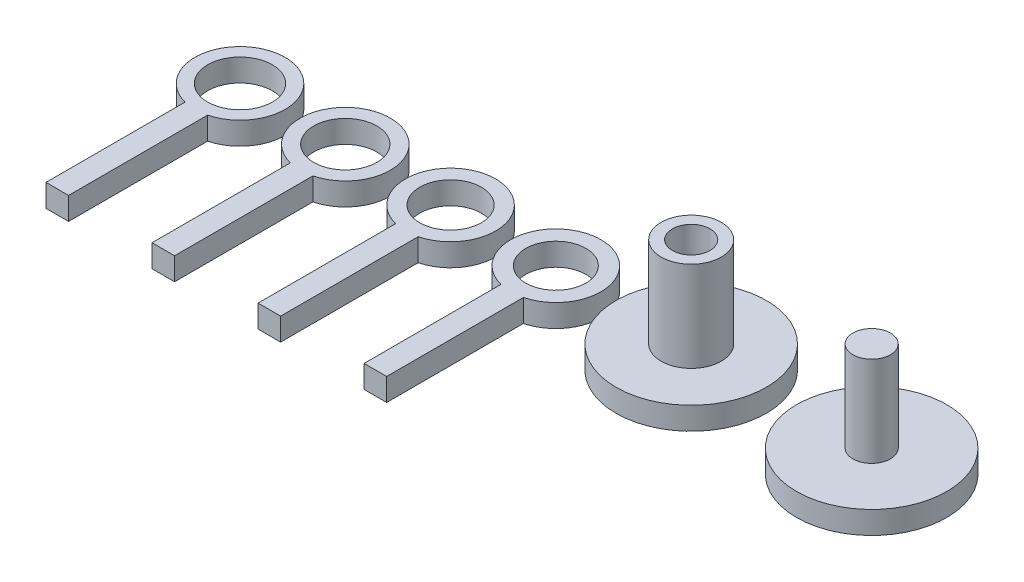
ISO-10303-21;
HEADER;
FILE_DESCRIPTION(('STEP AP214'),'2;1');
FILE_NAME('part.step','',(''),(''),'','','');
FILE_SCHEMA(('AUTOMOTIVE_DESIGN { 1 0 10303 214 1 1 1 1 }'));
ENDSEC;
DATA;
#1=APPLICATION_CONTEXT('core data for automotive mechanical design processes');
#2=APPLICATION_PROTOCOL_DEFINITION('international standard','automotive_design',2000,#1);
#3=PRODUCT_CONTEXT('',#1,'mechanical');
#4=PRODUCT('Part','Part','',(#3));
#5=PRODUCT_RELATED_PRODUCT_CATEGORY('part','',(#4));
#6=PRODUCT_DEFINITION_FORMATION('','',#4);
#7=PRODUCT_DEFINITION_CONTEXT('part definition',#1,'design');
#8=PRODUCT_DEFINITION('design','',#6,#7);
#9=PRODUCT_DEFINITION_SHAPE('','',#8);
#10=(LENGTH_UNIT() NAMED_UNIT(*) SI_UNIT(.MILLI.,.METRE.));
#11=(NAMED_UNIT(*) PLANE_ANGLE_UNIT() SI_UNIT($,.RADIAN.));
#12=(NAMED_UNIT(*) SI_UNIT($,.STERADIAN.) SOLID_ANGLE_UNIT());
#13=UNCERTAINTY_MEASURE_WITH_UNIT(LENGTH_MEASURE(1.E-05),#10,'distance_accuracy_value','');
#14=(GEOMETRIC_REPRESENTATION_CONTEXT(3) GLOBAL_UNCERTAINTY_ASSIGNED_CONTEXT((#13)) GLOBAL_UNIT_ASSIGNED_CONTEXT((#10,
#11,#12)) REPRESENTATION_CONTEXT('',''));
#15=CARTESIAN_POINT('',(0.,0.,0.));
#16=DIRECTION('',(0.,0.,1.));
#17=DIRECTION('',(1.,0.,0.));
#18=AXIS2_PLACEMENT_3D('',#15,#16,#17);
#19=CARTESIAN_POINT('',(-60.,3.,0.));
#20=DIRECTION('',(0.,1.,0.));
#21=DIRECTION('',(0.,0.,1.));
#22=AXIS2_PLACEMENT_3D('',#19,#20,#21);
#23=PLANE('',#22);
#24=DIRECTION('',(0.,0.,1.));
#25=VECTOR('',#24,1.);
#26=CARTESIAN_POINT('',(-61.5,3.,24.3));
#27=LINE('',#26,#25);
#28=CARTESIAN_POINT('',(-61.5,3.,5.80947501931113));
#29=VERTEX_POINT('',#28);
#30=CARTESIAN_POINT('',(-61.5,3.,24.3));
#31=VERTEX_POINT('',#30);
#32=EDGE_CURVE('E116',#29,#31,#27,.T.);
#33=ORIENTED_EDGE('',*,*,#32,.T.);
#34=DIRECTION('',(1.,0.,0.));
#35=VECTOR('',#34,1.);
#36=CARTESIAN_POINT('',(-61.5,3.,24.3));
#37=LINE('',#36,#35);
#38=CARTESIAN_POINT('',(-58.5,3.,24.3));
#39=VERTEX_POINT('',#38);
#40=EDGE_CURVE('E85',#31,#39,#37,.T.);
#41=ORIENTED_EDGE('',*,*,#40,.T.);
#42=DIRECTION('',(0.,0.,-1.));
#43=VECTOR('',#42,1.);
#44=CARTESIAN_POINT('',(-58.5,3.,24.3));
#45=LINE('',#44,#43);
#46=CARTESIAN_POINT('',(-58.5,3.,5.80947501931113));
#47=VERTEX_POINT('',#46);
#48=EDGE_CURVE('E124',#39,#47,#45,.T.);
#49=ORIENTED_EDGE('',*,*,#48,.T.);
#50=CARTESIAN_POINT('',(-60.,3.,0.));
#51=DIRECTION('',(0.,1.,0.));
#52=DIRECTION('',(0.,0.,1.));
#53=AXIS2_PLACEMENT_3D('',#50,#51,#52);
#54=CIRCLE('',#53,6.);
#55=EDGE_CURVE('E109',#47,#29,#54,.T.);
#56=ORIENTED_EDGE('',*,*,#55,.T.);
#57=EDGE_LOOP('',(#33,#41,#49,#56));
#58=FACE_BOUND('',#57,.T.);
#59=CARTESIAN_POINT('',(-60.,3.,0.));
#60=DIRECTION('',(0.,1.,0.));
#61=DIRECTION('',(0.,0.,1.));
#62=AXIS2_PLACEMENT_3D('',#59,#60,#61);
#63=CIRCLE('',#62,4.3);
#64=CARTESIAN_POINT('',(-60.,3.,4.3));
#65=VERTEX_POINT('',#64);
#66=EDGE_CURVE('E56',#65,#65,#63,.T.);
#67=ORIENTED_EDGE('',*,*,#66,.F.);
#68=EDGE_LOOP('',(#67));
#69=FACE_BOUND('',#68,.T.);
#70=ADVANCED_FACE('F52',(#58,#69),#23,.T.);
#71=CARTESIAN_POINT('',(-60.,0.,0.));
#72=DIRECTION('',(0.,1.,0.));
#73=DIRECTION('',(0.,0.,1.));
#74=AXIS2_PLACEMENT_3D('',#71,#72,#73);
#75=PLANE('',#74);
#76=DIRECTION('',(0.,0.,1.));
#77=VECTOR('',#76,1.);
#78=CARTESIAN_POINT('',(-61.5,0.,24.3));
#79=LINE('',#78,#77);
#80=CARTESIAN_POINT('',(-61.5,0.,5.80947501931113));
#81=VERTEX_POINT('',#80);
#82=CARTESIAN_POINT('',(-61.5,0.,24.3));
#83=VERTEX_POINT('',#82);
#84=EDGE_CURVE('E115',#81,#83,#79,.T.);
#85=ORIENTED_EDGE('',*,*,#84,.F.);
#86=CARTESIAN_POINT('',(-60.,0.,0.));
#87=DIRECTION('',(0.,1.,0.));
#88=DIRECTION('',(0.,0.,1.));
#89=AXIS2_PLACEMENT_3D('',#86,#87,#88);
#90=CIRCLE('',#89,6.);
#91=CARTESIAN_POINT('',(-58.5,0.,5.80947501931113));
#92=VERTEX_POINT('',#91);
#93=EDGE_CURVE('E95',#92,#81,#90,.T.);
#94=ORIENTED_EDGE('',*,*,#93,.F.);
#95=DIRECTION('',(0.,0.,-1.));
#96=VECTOR('',#95,1.);
#97=CARTESIAN_POINT('',(-58.5,0.,24.3));
#98=LINE('',#97,#96);
#99=CARTESIAN_POINT('',(-58.5,0.,24.3));
#100=VERTEX_POINT('',#99);
#101=EDGE_CURVE('E101',#100,#92,#98,.T.);
#102=ORIENTED_EDGE('',*,*,#101,.F.);
#103=DIRECTION('',(1.,0.,0.));
#104=VECTOR('',#103,1.);
#105=CARTESIAN_POINT('',(-61.5,0.,24.3));
#106=LINE('',#105,#104);
#107=EDGE_CURVE('E69',#83,#100,#106,.T.);
#108=ORIENTED_EDGE('',*,*,#107,.F.);
#109=EDGE_LOOP('',(#85,#94,#102,#108));
#110=FACE_BOUND('',#109,.T.);
#111=CARTESIAN_POINT('',(-60.,0.,0.));
#112=DIRECTION('',(0.,1.,0.));
#113=DIRECTION('',(0.,0.,1.));
#114=AXIS2_PLACEMENT_3D('',#111,#112,#113);
#115=CIRCLE('',#114,4.3);
#116=CARTESIAN_POINT('',(-60.,0.,4.3));
#117=VERTEX_POINT('',#116);
#118=EDGE_CURVE('E12',#117,#117,#115,.T.);
#119=ORIENTED_EDGE('',*,*,#118,.T.);
#120=EDGE_LOOP('',(#119));
#121=FACE_BOUND('',#120,.T.);
#122=ADVANCED_FACE('F112',(#110,#121),#75,.F.);
#123=CARTESIAN_POINT('',(-61.5,3.,24.3));
#124=DIRECTION('',(1.,0.,0.));
#125=DIRECTION('',(0.,0.,-1.));
#126=AXIS2_PLACEMENT_3D('',#123,#124,#125);
#127=PLANE('',#126);
#128=ORIENTED_EDGE('',*,*,#84,.T.);
#129=DIRECTION('',(0.,-1.,0.));
#130=VECTOR('',#129,1.);
#131=CARTESIAN_POINT('',(-61.5,3.,24.3));
#132=LINE('',#131,#130);
#133=EDGE_CURVE('E131',#31,#83,#132,.T.);
#134=ORIENTED_EDGE('',*,*,#133,.F.);
#135=ORIENTED_EDGE('',*,*,#32,.F.);
#136=DIRECTION('',(0.,-1.,0.));
#137=VECTOR('',#136,1.);
#138=CARTESIAN_POINT('',(-61.5,3.,5.80947501931113));
#139=LINE('',#138,#137);
#140=EDGE_CURVE('E110',#29,#81,#139,.T.);
#141=ORIENTED_EDGE('',*,*,#140,.T.);
#142=EDGE_LOOP('',(#128,#134,#135,#141));
#143=FACE_BOUND('',#142,.T.);
#144=ADVANCED_FACE('F130',(#143),#127,.F.);
#145=CARTESIAN_POINT('',(-61.5,3.,24.3));
#146=DIRECTION('',(0.,0.,-1.));
#147=DIRECTION('',(-1.,0.,0.));
#148=AXIS2_PLACEMENT_3D('',#145,#146,#147);
#149=PLANE('',#148);
#150=ORIENTED_EDGE('',*,*,#107,.T.);
#151=DIRECTION('',(0.,-1.,0.));
#152=VECTOR('',#151,1.);
#153=CARTESIAN_POINT('',(-58.5,3.,24.3));
#154=LINE('',#153,#152);
#155=EDGE_CURVE('E106',#39,#100,#154,.T.);
#156=ORIENTED_EDGE('',*,*,#155,.F.);
#157=ORIENTED_EDGE('',*,*,#40,.F.);
#158=ORIENTED_EDGE('',*,*,#133,.T.);
#159=EDGE_LOOP('',(#150,#156,#157,#158));
#160=FACE_BOUND('',#159,.T.);
#161=ADVANCED_FACE('F134',(#160),#149,.F.);
#162=CARTESIAN_POINT('',(-58.5,3.,24.3));
#163=DIRECTION('',(-1.,0.,0.));
#164=DIRECTION('',(0.,0.,1.));
#165=AXIS2_PLACEMENT_3D('',#162,#163,#164);
#166=PLANE('',#165);
#167=ORIENTED_EDGE('',*,*,#101,.T.);
#168=DIRECTION('',(0.,-1.,0.));
#169=VECTOR('',#168,1.);
#170=CARTESIAN_POINT('',(-58.5,3.,5.80947501931113));
#171=LINE('',#170,#169);
#172=EDGE_CURVE('E104',#47,#92,#171,.T.);
#173=ORIENTED_EDGE('',*,*,#172,.F.);
#174=ORIENTED_EDGE('',*,*,#48,.F.);
#175=ORIENTED_EDGE('',*,*,#155,.T.);
#176=EDGE_LOOP('',(#167,#173,#174,#175));
#177=FACE_BOUND('',#176,.T.);
#178=ADVANCED_FACE('F102',(#177),#166,.F.);
#179=CARTESIAN_POINT('',(-60.,3.,0.));
#180=DIRECTION('',(0.,-1.,0.));
#181=DIRECTION('',(0.,0.,-1.));
#182=AXIS2_PLACEMENT_3D('',#179,#180,#181);
#183=CYLINDRICAL_SURFACE('',#182,6.);
#184=ORIENTED_EDGE('',*,*,#93,.T.);
#185=ORIENTED_EDGE('',*,*,#140,.F.);
#186=ORIENTED_EDGE('',*,*,#55,.F.);
#187=ORIENTED_EDGE('',*,*,#172,.T.);
#188=EDGE_LOOP('',(#184,#185,#186,#187));
#189=FACE_BOUND('',#188,.T.);
#190=ADVANCED_FACE('F108',(#189),#183,.T.);
#191=CARTESIAN_POINT('',(-60.,3.,0.));
#192=DIRECTION('',(0.,-1.,0.));
#193=DIRECTION('',(0.,0.,-1.));
#194=AXIS2_PLACEMENT_3D('',#191,#192,#193);
#195=CYLINDRICAL_SURFACE('',#194,4.3);
#196=ORIENTED_EDGE('',*,*,#66,.T.);
#197=EDGE_LOOP('',(#196));
#198=FACE_BOUND('',#197,.T.);
#199=ORIENTED_EDGE('',*,*,#118,.F.);
#200=EDGE_LOOP('',(#199));
#201=FACE_BOUND('',#200,.T.);
#202=ADVANCED_FACE('F54',(#198,#201),#195,.F.);
#203=CLOSED_SHELL('',(#70,#122,#144,#161,#178,#190,#202));
#204=MANIFOLD_SOLID_BREP('B2',#203);
#205=CARTESIAN_POINT('',(-46.,3.,0.));
#206=DIRECTION('',(0.,1.,0.));
#207=DIRECTION('',(0.,0.,1.));
#208=AXIS2_PLACEMENT_3D('',#205,#206,#207);
#209=PLANE('',#208);
#210=CARTESIAN_POINT('',(-46.,3.,0.));
#211=DIRECTION('',(0.,1.,0.));
#212=DIRECTION('',(0.,0.,1.));
#213=AXIS2_PLACEMENT_3D('',#210,#211,#212);
#214=CIRCLE('',#213,6.);
#215=CARTESIAN_POINT('',(-44.5,3.,5.80947501931113));
#216=VERTEX_POINT('',#215);
#217=CARTESIAN_POINT('',(-47.5,3.,5.80947501931113));
#218=VERTEX_POINT('',#217);
#219=EDGE_CURVE('E271',#216,#218,#214,.T.);
#220=ORIENTED_EDGE('',*,*,#219,.T.);
#221=DIRECTION('',(0.,0.,1.));
#222=VECTOR('',#221,1.);
#223=CARTESIAN_POINT('',(-47.5,3.,24.2));
#224=LINE('',#223,#222);
#225=CARTESIAN_POINT('',(-47.5,3.,24.2));
#226=VERTEX_POINT('',#225);
#227=EDGE_CURVE('E240',#218,#226,#224,.T.);
#228=ORIENTED_EDGE('',*,*,#227,.T.);
#229=DIRECTION('',(1.,0.,0.));
#230=VECTOR('',#229,1.);
#231=CARTESIAN_POINT('',(-47.5,3.,24.2));
#232=LINE('',#231,#230);
#233=CARTESIAN_POINT('',(-44.5,3.,24.2));
#234=VERTEX_POINT('',#233);
#235=EDGE_CURVE('E279',#226,#234,#232,.T.);
#236=ORIENTED_EDGE('',*,*,#235,.T.);
#237=DIRECTION('',(0.,0.,-1.));
#238=VECTOR('',#237,1.);
#239=CARTESIAN_POINT('',(-44.5,3.,24.2));
#240=LINE('',#239,#238);
#241=EDGE_CURVE('E264',#234,#216,#240,.T.);
#242=ORIENTED_EDGE('',*,*,#241,.T.);
#243=EDGE_LOOP('',(#220,#228,#236,#242));
#244=FACE_BOUND('',#243,.T.);
#245=CARTESIAN_POINT('',(-46.,3.,0.));
#246=DIRECTION('',(0.,1.,0.));
#247=DIRECTION('',(0.,0.,1.));
#248=AXIS2_PLACEMENT_3D('',#245,#246,#247);
#249=CIRCLE('',#248,4.2);
#250=CARTESIAN_POINT('',(-46.,3.,4.2));
#251=VERTEX_POINT('',#250);
#252=EDGE_CURVE('E211',#251,#251,#249,.T.);
#253=ORIENTED_EDGE('',*,*,#252,.F.);
#254=EDGE_LOOP('',(#253));
#255=FACE_BOUND('',#254,.T.);
#256=ADVANCED_FACE('F207',(#244,#255),#209,.T.);
#257=CARTESIAN_POINT('',(-46.,0.,0.));
#258=DIRECTION('',(0.,1.,0.));
#259=DIRECTION('',(0.,0.,1.));
#260=AXIS2_PLACEMENT_3D('',#257,#258,#259);
#261=PLANE('',#260);
#262=CARTESIAN_POINT('',(-46.,0.,0.));
#263=DIRECTION('',(0.,1.,0.));
#264=DIRECTION('',(0.,0.,1.));
#265=AXIS2_PLACEMENT_3D('',#262,#263,#264);
#266=CIRCLE('',#265,6.);
#267=CARTESIAN_POINT('',(-44.5,0.,5.80947501931113));
#268=VERTEX_POINT('',#267);
#269=CARTESIAN_POINT('',(-47.5,0.,5.80947501931113));
#270=VERTEX_POINT('',#269);
#271=EDGE_CURVE('E270',#268,#270,#266,.T.);
#272=ORIENTED_EDGE('',*,*,#271,.F.);
#273=DIRECTION('',(0.,0.,-1.));
#274=VECTOR('',#273,1.);
#275=CARTESIAN_POINT('',(-44.5,0.,24.2));
#276=LINE('',#275,#274);
#277=CARTESIAN_POINT('',(-44.5,0.,24.2));
#278=VERTEX_POINT('',#277);
#279=EDGE_CURVE('E250',#278,#268,#276,.T.);
#280=ORIENTED_EDGE('',*,*,#279,.F.);
#281=DIRECTION('',(1.,0.,0.));
#282=VECTOR('',#281,1.);
#283=CARTESIAN_POINT('',(-47.5,0.,24.2));
#284=LINE('',#283,#282);
#285=CARTESIAN_POINT('',(-47.5,0.,24.2));
#286=VERTEX_POINT('',#285);
#287=EDGE_CURVE('E256',#286,#278,#284,.T.);
#288=ORIENTED_EDGE('',*,*,#287,.F.);
#289=DIRECTION('',(0.,0.,1.));
#290=VECTOR('',#289,1.);
#291=CARTESIAN_POINT('',(-47.5,0.,24.2));
#292=LINE('',#291,#290);
#293=EDGE_CURVE('E224',#270,#286,#292,.T.);
#294=ORIENTED_EDGE('',*,*,#293,.F.);
#295=EDGE_LOOP('',(#272,#280,#288,#294));
#296=FACE_BOUND('',#295,.T.);
#297=CARTESIAN_POINT('',(-46.,0.,0.));
#298=DIRECTION('',(0.,1.,0.));
#299=DIRECTION('',(0.,0.,1.));
#300=AXIS2_PLACEMENT_3D('',#297,#298,#299);
#301=CIRCLE('',#300,4.2);
#302=CARTESIAN_POINT('',(-46.,0.,4.2));
#303=VERTEX_POINT('',#302);
#304=EDGE_CURVE('E50',#303,#303,#301,.T.);
#305=ORIENTED_EDGE('',*,*,#304,.T.);
#306=EDGE_LOOP('',(#305));
#307=FACE_BOUND('',#306,.T.);
#308=ADVANCED_FACE('F267',(#296,#307),#261,.F.);
#309=CARTESIAN_POINT('',(-46.,3.,0.));
#310=DIRECTION('',(0.,-1.,0.));
#311=DIRECTION('',(0.,0.,-1.));
#312=AXIS2_PLACEMENT_3D('',#309,#310,#311);
#313=CYLINDRICAL_SURFACE('',#312,6.);
#314=ORIENTED_EDGE('',*,*,#271,.T.);
#315=DIRECTION('',(0.,-1.,0.));
#316=VECTOR('',#315,1.);
#317=CARTESIAN_POINT('',(-47.5,3.,5.80947501931113));
#318=LINE('',#317,#316);
#319=EDGE_CURVE('E286',#218,#270,#318,.T.);
#320=ORIENTED_EDGE('',*,*,#319,.F.);
#321=ORIENTED_EDGE('',*,*,#219,.F.);
#322=DIRECTION('',(0.,-1.,0.));
#323=VECTOR('',#322,1.);
#324=CARTESIAN_POINT('',(-44.5,3.,5.80947501931113));
#325=LINE('',#324,#323);
#326=EDGE_CURVE('E265',#216,#268,#325,.T.);
#327=ORIENTED_EDGE('',*,*,#326,.T.);
#328=EDGE_LOOP('',(#314,#320,#321,#327));
#329=FACE_BOUND('',#328,.T.);
#330=ADVANCED_FACE('F285',(#329),#313,.T.);
#331=CARTESIAN_POINT('',(-47.5,3.,24.2));
#332=DIRECTION('',(1.,0.,0.));
#333=DIRECTION('',(0.,0.,-1.));
#334=AXIS2_PLACEMENT_3D('',#331,#332,#333);
#335=PLANE('',#334);
#336=ORIENTED_EDGE('',*,*,#293,.T.);
#337=DIRECTION('',(0.,-1.,0.));
#338=VECTOR('',#337,1.);
#339=CARTESIAN_POINT('',(-47.5,3.,24.2));
#340=LINE('',#339,#338);
#341=EDGE_CURVE('E261',#226,#286,#340,.T.);
#342=ORIENTED_EDGE('',*,*,#341,.F.);
#343=ORIENTED_EDGE('',*,*,#227,.F.);
#344=ORIENTED_EDGE('',*,*,#319,.T.);
#345=EDGE_LOOP('',(#336,#342,#343,#344));
#346=FACE_BOUND('',#345,.T.);
#347=ADVANCED_FACE('F289',(#346),#335,.F.);
#348=CARTESIAN_POINT('',(-47.5,3.,24.2));
#349=DIRECTION('',(0.,0.,-1.));
#350=DIRECTION('',(-1.,0.,0.));
#351=AXIS2_PLACEMENT_3D('',#348,#349,#350);
#352=PLANE('',#351);
#353=ORIENTED_EDGE('',*,*,#287,.T.);
#354=DIRECTION('',(0.,-1.,0.));
#355=VECTOR('',#354,1.);
#356=CARTESIAN_POINT('',(-44.5,3.,24.2));
#357=LINE('',#356,#355);
#358=EDGE_CURVE('E259',#234,#278,#357,.T.);
#359=ORIENTED_EDGE('',*,*,#358,.F.);
#360=ORIENTED_EDGE('',*,*,#235,.F.);
#361=ORIENTED_EDGE('',*,*,#341,.T.);
#362=EDGE_LOOP('',(#353,#359,#360,#361));
#363=FACE_BOUND('',#362,.T.);
#364=ADVANCED_FACE('F257',(#363),#352,.F.);
#365=CARTESIAN_POINT('',(-44.5,3.,24.2));
#366=DIRECTION('',(-1.,0.,0.));
#367=DIRECTION('',(0.,0.,1.));
#368=AXIS2_PLACEMENT_3D('',#365,#366,#367);
#369=PLANE('',#368);
#370=ORIENTED_EDGE('',*,*,#279,.T.);
#371=ORIENTED_EDGE('',*,*,#326,.F.);
#372=ORIENTED_EDGE('',*,*,#241,.F.);
#373=ORIENTED_EDGE('',*,*,#358,.T.);
#374=EDGE_LOOP('',(#370,#371,#372,#373));
#375=FACE_BOUND('',#374,.T.);
#376=ADVANCED_FACE('F263',(#375),#369,.F.);
#377=CARTESIAN_POINT('',(-46.,3.,0.));
#378=DIRECTION('',(0.,-1.,0.));
#379=DIRECTION('',(0.,0.,-1.));
#380=AXIS2_PLACEMENT_3D('',#377,#378,#379);
#381=CYLINDRICAL_SURFACE('',#380,4.2);
#382=ORIENTED_EDGE('',*,*,#252,.T.);
#383=EDGE_LOOP('',(#382));
#384=FACE_BOUND('',#383,.T.);
#385=ORIENTED_EDGE('',*,*,#304,.F.);
#386=EDGE_LOOP('',(#385));
#387=FACE_BOUND('',#386,.T.);
#388=ADVANCED_FACE('F209',(#384,#387),#381,.F.);
#389=CLOSED_SHELL('',(#256,#308,#330,#347,#364,#376,#388));
#390=MANIFOLD_SOLID_BREP('B6',#389);
#391=CARTESIAN_POINT('',(-32.,3.,0.));
#392=DIRECTION('',(0.,1.,0.));
#393=DIRECTION('',(0.,0.,1.));
#394=AXIS2_PLACEMENT_3D('',#391,#392,#393);
#395=PLANE('',#394);
#396=CARTESIAN_POINT('',(-32.,3.,0.));
#397=DIRECTION('',(0.,1.,0.));
#398=DIRECTION('',(0.,0.,1.));
#399=AXIS2_PLACEMENT_3D('',#396,#397,#398);
#400=CIRCLE('',#399,6.);
#401=CARTESIAN_POINT('',(-30.5,3.,5.80947501931113));
#402=VERTEX_POINT('',#401);
#403=CARTESIAN_POINT('',(-33.5,3.,5.80947501931113));
#404=VERTEX_POINT('',#403);
#405=EDGE_CURVE('E426',#402,#404,#400,.T.);
#406=ORIENTED_EDGE('',*,*,#405,.T.);
#407=DIRECTION('',(0.,0.,1.));
#408=VECTOR('',#407,1.);
#409=CARTESIAN_POINT('',(-33.5,3.,24.1));
#410=LINE('',#409,#408);
#411=CARTESIAN_POINT('',(-33.5,3.,24.1));
#412=VERTEX_POINT('',#411);
#413=EDGE_CURVE('E395',#404,#412,#410,.T.);
#414=ORIENTED_EDGE('',*,*,#413,.T.);
#415=DIRECTION('',(1.,0.,0.));
#416=VECTOR('',#415,1.);
#417=CARTESIAN_POINT('',(-33.5,3.,24.1));
#418=LINE('',#417,#416);
#419=CARTESIAN_POINT('',(-30.5,3.,24.1));
#420=VERTEX_POINT('',#419);
#421=EDGE_CURVE('E434',#412,#420,#418,.T.);
#422=ORIENTED_EDGE('',*,*,#421,.T.);
#423=DIRECTION('',(0.,0.,-1.));
#424=VECTOR('',#423,1.);
#425=CARTESIAN_POINT('',(-30.5,3.,24.1));
#426=LINE('',#425,#424);
#427=EDGE_CURVE('E419',#420,#402,#426,.T.);
#428=ORIENTED_EDGE('',*,*,#427,.T.);
#429=EDGE_LOOP('',(#406,#414,#422,#428));
#430=FACE_BOUND('',#429,.T.);
#431=CARTESIAN_POINT('',(-32.,3.,0.));
#432=DIRECTION('',(0.,1.,0.));
#433=DIRECTION('',(0.,0.,1.));
#434=AXIS2_PLACEMENT_3D('',#431,#432,#433);
#435=CIRCLE('',#434,4.1);
#436=CARTESIAN_POINT('',(-32.,3.,4.1));
#437=VERTEX_POINT('',#436);
#438=EDGE_CURVE('E366',#437,#437,#435,.T.);
#439=ORIENTED_EDGE('',*,*,#438,.F.);
#440=EDGE_LOOP('',(#439));
#441=FACE_BOUND('',#440,.T.);
#442=ADVANCED_FACE('F362',(#430,#441),#395,.T.);
#443=CARTESIAN_POINT('',(-32.,0.,0.));
#444=DIRECTION('',(0.,1.,0.));
#445=DIRECTION('',(0.,0.,1.));
#446=AXIS2_PLACEMENT_3D('',#443,#444,#445);
#447=PLANE('',#446);
#448=CARTESIAN_POINT('',(-32.,0.,0.));
#449=DIRECTION('',(0.,1.,0.));
#450=DIRECTION('',(0.,0.,1.));
#451=AXIS2_PLACEMENT_3D('',#448,#449,#450);
#452=CIRCLE('',#451,6.);
#453=CARTESIAN_POINT('',(-30.5,0.,5.80947501931113));
#454=VERTEX_POINT('',#453);
#455=CARTESIAN_POINT('',(-33.5,0.,5.80947501931113));
#456=VERTEX_POINT('',#455);
#457=EDGE_CURVE('E425',#454,#456,#452,.T.);
#458=ORIENTED_EDGE('',*,*,#457,.F.);
#459=DIRECTION('',(0.,0.,-1.));
#460=VECTOR('',#459,1.);
#461=CARTESIAN_POINT('',(-30.5,0.,24.1));
#462=LINE('',#461,#460);
#463=CARTESIAN_POINT('',(-30.5,0.,24.1));
#464=VERTEX_POINT('',#463);
#465=EDGE_CURVE('E405',#464,#454,#462,.T.);
#466=ORIENTED_EDGE('',*,*,#465,.F.);
#467=DIRECTION('',(1.,0.,0.));
#468=VECTOR('',#467,1.);
#469=CARTESIAN_POINT('',(-33.5,0.,24.1));
#470=LINE('',#469,#468);
#471=CARTESIAN_POINT('',(-33.5,0.,24.1));
#472=VERTEX_POINT('',#471);
#473=EDGE_CURVE('E411',#472,#464,#470,.T.);
#474=ORIENTED_EDGE('',*,*,#473,.F.);
#475=DIRECTION('',(0.,0.,1.));
#476=VECTOR('',#475,1.);
#477=CARTESIAN_POINT('',(-33.5,0.,24.1));
#478=LINE('',#477,#476);
#479=EDGE_CURVE('E379',#456,#472,#478,.T.);
#480=ORIENTED_EDGE('',*,*,#479,.F.);
#481=EDGE_LOOP('',(#458,#466,#474,#480));
#482=FACE_BOUND('',#481,.T.);
#483=CARTESIAN_POINT('',(-32.,0.,0.));
#484=DIRECTION('',(0.,1.,0.));
#485=DIRECTION('',(0.,0.,1.));
#486=AXIS2_PLACEMENT_3D('',#483,#484,#485);
#487=CIRCLE('',#486,4.1);
#488=CARTESIAN_POINT('',(-32.,0.,4.1));
#489=VERTEX_POINT('',#488);
#490=EDGE_CURVE('E205',#489,#489,#487,.T.);
#491=ORIENTED_EDGE('',*,*,#490,.T.);
#492=EDGE_LOOP('',(#491));
#493=FACE_BOUND('',#492,.T.);
#494=ADVANCED_FACE('F422',(#482,#493),#447,.F.);
#495=CARTESIAN_POINT('',(-32.,3.,0.));
#496=DIRECTION('',(0.,-1.,0.));
#497=DIRECTION('',(0.,0.,-1.));
#498=AXIS2_PLACEMENT_3D('',#495,#496,#497);
#499=CYLINDRICAL_SURFACE('',#498,6.);
#500=ORIENTED_EDGE('',*,*,#457,.T.);
#501=DIRECTION('',(0.,-1.,0.));
#502=VECTOR('',#501,1.);
#503=CARTESIAN_POINT('',(-33.5,3.,5.80947501931113));
#504=LINE('',#503,#502);
#505=EDGE_CURVE('E441',#404,#456,#504,.T.);
#506=ORIENTED_EDGE('',*,*,#505,.F.);
#507=ORIENTED_EDGE('',*,*,#405,.F.);
#508=DIRECTION('',(0.,-1.,0.));
#509=VECTOR('',#508,1.);
#510=CARTESIAN_POINT('',(-30.5,3.,5.80947501931113));
#511=LINE('',#510,#509);
#512=EDGE_CURVE('E420',#402,#454,#511,.T.);
#513=ORIENTED_EDGE('',*,*,#512,.T.);
#514=EDGE_LOOP('',(#500,#506,#507,#513));
#515=FACE_BOUND('',#514,.T.);
#516=ADVANCED_FACE('F440',(#515),#499,.T.);
#517=CARTESIAN_POINT('',(-33.5,3.,24.1));
#518=DIRECTION('',(1.,0.,0.));
#519=DIRECTION('',(0.,0.,-1.));
#520=AXIS2_PLACEMENT_3D('',#517,#518,#519);
#521=PLANE('',#520);
#522=ORIENTED_EDGE('',*,*,#479,.T.);
#523=DIRECTION('',(0.,-1.,0.));
#524=VECTOR('',#523,1.);
#525=CARTESIAN_POINT('',(-33.5,3.,24.1));
#526=LINE('',#525,#524);
#527=EDGE_CURVE('E416',#412,#472,#526,.T.);
#528=ORIENTED_EDGE('',*,*,#527,.F.);
#529=ORIENTED_EDGE('',*,*,#413,.F.);
#530=ORIENTED_EDGE('',*,*,#505,.T.);
#531=EDGE_LOOP('',(#522,#528,#529,#530));
#532=FACE_BOUND('',#531,.T.);
#533=ADVANCED_FACE('F444',(#532),#521,.F.);
#534=CARTESIAN_POINT('',(-33.5,3.,24.1));
#535=DIRECTION('',(0.,0.,-1.));
#536=DIRECTION('',(-1.,0.,0.));
#537=AXIS2_PLACEMENT_3D('',#534,#535,#536);
#538=PLANE('',#537);
#539=ORIENTED_EDGE('',*,*,#473,.T.);
#540=DIRECTION('',(0.,-1.,0.));
#541=VECTOR('',#540,1.);
#542=CARTESIAN_POINT('',(-30.5,3.,24.1));
#543=LINE('',#542,#541);
#544=EDGE_CURVE('E414',#420,#464,#543,.T.);
#545=ORIENTED_EDGE('',*,*,#544,.F.);
#546=ORIENTED_EDGE('',*,*,#421,.F.);
#547=ORIENTED_EDGE('',*,*,#527,.T.);
#548=EDGE_LOOP('',(#539,#545,#546,#547));
#549=FACE_BOUND('',#548,.T.);
#550=ADVANCED_FACE('F412',(#549),#538,.F.);
#551=CARTESIAN_POINT('',(-30.5,3.,24.1));
#552=DIRECTION('',(-1.,0.,0.));
#553=DIRECTION('',(0.,0.,1.));
#554=AXIS2_PLACEMENT_3D('',#551,#552,#553);
#555=PLANE('',#554);
#556=ORIENTED_EDGE('',*,*,#465,.T.);
#557=ORIENTED_EDGE('',*,*,#512,.F.);
#558=ORIENTED_EDGE('',*,*,#427,.F.);
#559=ORIENTED_EDGE('',*,*,#544,.T.);
#560=EDGE_LOOP('',(#556,#557,#558,#559));
#561=FACE_BOUND('',#560,.T.);
#562=ADVANCED_FACE('F418',(#561),#555,.F.);
#563=CARTESIAN_POINT('',(-32.,3.,0.));
#564=DIRECTION('',(0.,-1.,0.));
#565=DIRECTION('',(0.,0.,-1.));
#566=AXIS2_PLACEMENT_3D('',#563,#564,#565);
#567=CYLINDRICAL_SURFACE('',#566,4.1);
#568=ORIENTED_EDGE('',*,*,#438,.T.);
#569=EDGE_LOOP('',(#568));
#570=FACE_BOUND('',#569,.T.);
#571=ORIENTED_EDGE('',*,*,#490,.F.);
#572=EDGE_LOOP('',(#571));
#573=FACE_BOUND('',#572,.T.);
#574=ADVANCED_FACE('F364',(#570,#573),#567,.F.);
#575=CLOSED_SHELL('',(#442,#494,#516,#533,#550,#562,#574));
#576=MANIFOLD_SOLID_BREP('B44',#575);
#577=CARTESIAN_POINT('',(-18.,3.,0.));
#578=DIRECTION('',(0.,1.,0.));
#579=DIRECTION('',(0.,0.,1.));
#580=AXIS2_PLACEMENT_3D('',#577,#578,#579);
#581=PLANE('',#580);
#582=CARTESIAN_POINT('',(-18.,3.,0.));
#583=DIRECTION('',(0.,1.,0.));
#584=DIRECTION('',(0.,0.,1.));
#585=AXIS2_PLACEMENT_3D('',#582,#583,#584);
#586=CIRCLE('',#585,6.);
#587=CARTESIAN_POINT('',(-16.5,3.,5.80947501931113));
#588=VERTEX_POINT('',#587);
#589=CARTESIAN_POINT('',(-19.5,3.,5.80947501931113));
#590=VERTEX_POINT('',#589);
#591=EDGE_CURVE('E567',#588,#590,#586,.T.);
#592=ORIENTED_EDGE('',*,*,#591,.T.);
#593=DIRECTION('',(0.,0.,1.));
#594=VECTOR('',#593,1.);
#595=CARTESIAN_POINT('',(-19.5,3.,24.));
#596=LINE('',#595,#594);
#597=CARTESIAN_POINT('',(-19.5,3.,24.));
#598=VERTEX_POINT('',#597);
#599=EDGE_CURVE('E562',#590,#598,#596,.T.);
#600=ORIENTED_EDGE('',*,*,#599,.T.);
#601=DIRECTION('',(1.,0.,0.));
#602=VECTOR('',#601,1.);
#603=CARTESIAN_POINT('',(-19.5,3.,24.));
#604=LINE('',#603,#602);
#605=CARTESIAN_POINT('',(-16.5,3.,24.));
#606=VERTEX_POINT('',#605);
#607=EDGE_CURVE('E565',#598,#606,#604,.T.);
#608=ORIENTED_EDGE('',*,*,#607,.T.);
#609=DIRECTION('',(0.,0.,-1.));
#610=VECTOR('',#609,1.);
#611=CARTESIAN_POINT('',(-16.5,3.,24.));
#612=LINE('',#611,#610);
#613=EDGE_CURVE('E532',#606,#588,#612,.T.);
#614=ORIENTED_EDGE('',*,*,#613,.T.);
#615=EDGE_LOOP('',(#592,#600,#608,#614));
#616=FACE_BOUND('',#615,.T.);
#617=CARTESIAN_POINT('',(-18.,3.,0.));
#618=DIRECTION('',(0.,1.,0.));
#619=DIRECTION('',(0.,0.,1.));
#620=AXIS2_PLACEMENT_3D('',#617,#618,#619);
#621=CIRCLE('',#620,4.);
#622=CARTESIAN_POINT('',(-18.,3.,4.));
#623=VERTEX_POINT('',#622);
#624=EDGE_CURVE('E582',#623,#623,#621,.T.);
#625=ORIENTED_EDGE('',*,*,#624,.F.);
#626=EDGE_LOOP('',(#625));
#627=FACE_BOUND('',#626,.T.);
#628=ADVANCED_FACE('F515',(#616,#627),#581,.T.);
#629=CARTESIAN_POINT('',(-18.,0.,0.));
#630=DIRECTION('',(0.,1.,0.));
#631=DIRECTION('',(0.,0.,1.));
#632=AXIS2_PLACEMENT_3D('',#629,#630,#631);
#633=PLANE('',#632);
#634=CARTESIAN_POINT('',(-18.,0.,0.));
#635=DIRECTION('',(0.,1.,0.));
#636=DIRECTION('',(0.,0.,1.));
#637=AXIS2_PLACEMENT_3D('',#634,#635,#636);
#638=CIRCLE('',#637,6.);
#639=CARTESIAN_POINT('',(-16.5,0.,5.80947501931113));
#640=VERTEX_POINT('',#639);
#641=CARTESIAN_POINT('',(-19.5,0.,5.80947501931113));
#642=VERTEX_POINT('',#641);
#643=EDGE_CURVE('E579',#640,#642,#638,.T.);
#644=ORIENTED_EDGE('',*,*,#643,.F.);
#645=DIRECTION('',(0.,0.,-1.));
#646=VECTOR('',#645,1.);
#647=CARTESIAN_POINT('',(-16.5,0.,24.));
#648=LINE('',#647,#646);
#649=CARTESIAN_POINT('',(-16.5,0.,24.));
#650=VERTEX_POINT('',#649);
#651=EDGE_CURVE('E555',#650,#640,#648,.T.);
#652=ORIENTED_EDGE('',*,*,#651,.F.);
#653=DIRECTION('',(1.,0.,0.));
#654=VECTOR('',#653,1.);
#655=CARTESIAN_POINT('',(-19.5,0.,24.));
#656=LINE('',#655,#654);
#657=CARTESIAN_POINT('',(-19.5,0.,24.));
#658=VERTEX_POINT('',#657);
#659=EDGE_CURVE('E549',#658,#650,#656,.T.);
#660=ORIENTED_EDGE('',*,*,#659,.F.);
#661=DIRECTION('',(0.,0.,1.));
#662=VECTOR('',#661,1.);
#663=CARTESIAN_POINT('',(-19.5,0.,24.));
#664=LINE('',#663,#662);
#665=EDGE_CURVE('E571',#642,#658,#664,.T.);
#666=ORIENTED_EDGE('',*,*,#665,.F.);
#667=EDGE_LOOP('',(#644,#652,#660,#666));
#668=FACE_BOUND('',#667,.T.);
#669=CARTESIAN_POINT('',(-18.,0.,0.));
#670=DIRECTION('',(0.,1.,0.));
#671=DIRECTION('',(0.,0.,1.));
#672=AXIS2_PLACEMENT_3D('',#669,#670,#671);
#673=CIRCLE('',#672,4.);
#674=CARTESIAN_POINT('',(-18.,0.,4.));
#675=VERTEX_POINT('',#674);
#676=EDGE_CURVE('E594',#675,#675,#673,.T.);
#677=ORIENTED_EDGE('',*,*,#676,.T.);
#678=EDGE_LOOP('',(#677));
#679=FACE_BOUND('',#678,.T.);
#680=ADVANCED_FACE('F590',(#668,#679),#633,.F.);
#681=CARTESIAN_POINT('',(-18.,3.,0.));
#682=DIRECTION('',(0.,-1.,0.));
#683=DIRECTION('',(0.,0.,-1.));
#684=AXIS2_PLACEMENT_3D('',#681,#682,#683);
#685=CYLINDRICAL_SURFACE('',#684,6.);
#686=ORIENTED_EDGE('',*,*,#643,.T.);
#687=DIRECTION('',(0.,-1.,0.));
#688=VECTOR('',#687,1.);
#689=CARTESIAN_POINT('',(-19.5,3.,5.80947501931113));
#690=LINE('',#689,#688);
#691=EDGE_CURVE('E360',#590,#642,#690,.T.);
#692=ORIENTED_EDGE('',*,*,#691,.F.);
#693=ORIENTED_EDGE('',*,*,#591,.F.);
#694=DIRECTION('',(0.,-1.,0.));
#695=VECTOR('',#694,1.);
#696=CARTESIAN_POINT('',(-16.5,3.,5.80947501931113));
#697=LINE('',#696,#695);
#698=EDGE_CURVE('E575',#588,#640,#697,.T.);
#699=ORIENTED_EDGE('',*,*,#698,.T.);
#700=EDGE_LOOP('',(#686,#692,#693,#699));
#701=FACE_BOUND('',#700,.T.);
#702=ADVANCED_FACE('F517',(#701),#685,.T.);
#703=CARTESIAN_POINT('',(-19.5,3.,24.));
#704=DIRECTION('',(1.,0.,0.));
#705=DIRECTION('',(0.,0.,-1.));
#706=AXIS2_PLACEMENT_3D('',#703,#704,#705);
#707=PLANE('',#706);
#708=ORIENTED_EDGE('',*,*,#665,.T.);
#709=DIRECTION('',(0.,-1.,0.));
#710=VECTOR('',#709,1.);
#711=CARTESIAN_POINT('',(-19.5,3.,24.));
#712=LINE('',#711,#710);
#713=EDGE_CURVE('E524',#598,#658,#712,.T.);
#714=ORIENTED_EDGE('',*,*,#713,.F.);
#715=ORIENTED_EDGE('',*,*,#599,.F.);
#716=ORIENTED_EDGE('',*,*,#691,.T.);
#717=EDGE_LOOP('',(#708,#714,#715,#716));
#718=FACE_BOUND('',#717,.T.);
#719=ADVANCED_FACE('F570',(#718),#707,.F.);
#720=CARTESIAN_POINT('',(-19.5,3.,24.));
#721=DIRECTION('',(0.,0.,-1.));
#722=DIRECTION('',(-1.,0.,0.));
#723=AXIS2_PLACEMENT_3D('',#720,#721,#722);
#724=PLANE('',#723);
#725=ORIENTED_EDGE('',*,*,#659,.T.);
#726=DIRECTION('',(0.,-1.,0.));
#727=VECTOR('',#726,1.);
#728=CARTESIAN_POINT('',(-16.5,3.,24.));
#729=LINE('',#728,#727);
#730=EDGE_CURVE('E572',#606,#650,#729,.T.);
#731=ORIENTED_EDGE('',*,*,#730,.F.);
#732=ORIENTED_EDGE('',*,*,#607,.F.);
#733=ORIENTED_EDGE('',*,*,#713,.T.);
#734=EDGE_LOOP('',(#725,#731,#732,#733));
#735=FACE_BOUND('',#734,.T.);
#736=ADVANCED_FACE('F573',(#735),#724,.F.);
#737=CARTESIAN_POINT('',(-16.5,3.,24.));
#738=DIRECTION('',(-1.,0.,0.));
#739=DIRECTION('',(0.,0.,1.));
#740=AXIS2_PLACEMENT_3D('',#737,#738,#739);
#741=PLANE('',#740);
#742=ORIENTED_EDGE('',*,*,#651,.T.);
#743=ORIENTED_EDGE('',*,*,#698,.F.);
#744=ORIENTED_EDGE('',*,*,#613,.F.);
#745=ORIENTED_EDGE('',*,*,#730,.T.);
#746=EDGE_LOOP('',(#742,#743,#744,#745));
#747=FACE_BOUND('',#746,.T.);
#748=ADVANCED_FACE('F587',(#747),#741,.F.);
#749=CARTESIAN_POINT('',(-18.,3.,0.));
#750=DIRECTION('',(0.,-1.,0.));
#751=DIRECTION('',(0.,0.,-1.));
#752=AXIS2_PLACEMENT_3D('',#749,#750,#751);
#753=CYLINDRICAL_SURFACE('',#752,4.);
#754=ORIENTED_EDGE('',*,*,#624,.T.);
#755=EDGE_LOOP('',(#754));
#756=FACE_BOUND('',#755,.T.);
#757=ORIENTED_EDGE('',*,*,#676,.F.);
#758=EDGE_LOOP('',(#757));
#759=FACE_BOUND('',#758,.T.);
#760=ADVANCED_FACE('F600',(#756,#759),#753,.F.);
#761=CLOSED_SHELL('',(#628,#680,#702,#719,#736,#748,#760));
#762=MANIFOLD_SOLID_BREP('B199',#761);
#763=CARTESIAN_POINT('',(24.,3.,0.));
#764=DIRECTION('',(0.,-1.,0.));
#765=DIRECTION('',(0.,0.,-1.));
#766=AXIS2_PLACEMENT_3D('',#763,#764,#765);
#767=CYLINDRICAL_SURFACE('',#766,10.);
#768=CARTESIAN_POINT('',(24.,3.,0.));
#769=DIRECTION('',(0.,1.,0.));
#770=DIRECTION('',(0.,0.,1.));
#771=AXIS2_PLACEMENT_3D('',#768,#769,#770);
#772=CIRCLE('',#771,10.);
#773=CARTESIAN_POINT('',(24.,3.,10.));
#774=VERTEX_POINT('',#773);
#775=EDGE_CURVE('E671',#774,#774,#772,.T.);
#776=ORIENTED_EDGE('',*,*,#775,.F.);
#777=EDGE_LOOP('',(#776));
#778=FACE_BOUND('',#777,.T.);
#779=CARTESIAN_POINT('',(24.,0.,0.));
#780=DIRECTION('',(0.,1.,0.));
#781=DIRECTION('',(0.,0.,1.));
#782=AXIS2_PLACEMENT_3D('',#779,#780,#781);
#783=CIRCLE('',#782,10.);
#784=CARTESIAN_POINT('',(24.,0.,10.));
#785=VERTEX_POINT('',#784);
#786=EDGE_CURVE('E675',#785,#785,#783,.T.);
#787=ORIENTED_EDGE('',*,*,#786,.T.);
#788=EDGE_LOOP('',(#787));
#789=FACE_BOUND('',#788,.T.);
#790=ADVANCED_FACE('F667',(#778,#789),#767,.T.);
#791=CARTESIAN_POINT('',(24.,3.,0.));
#792=DIRECTION('',(0.,1.,0.));
#793=DIRECTION('',(0.,0.,1.));
#794=AXIS2_PLACEMENT_3D('',#791,#792,#793);
#795=PLANE('',#794);
#796=CARTESIAN_POINT('',(24.,3.,0.));
#797=DIRECTION('',(0.,1.,0.));
#798=DIRECTION('',(0.,0.,1.));
#799=AXIS2_PLACEMENT_3D('',#796,#797,#798);
#800=CIRCLE('',#799,2.5);
#801=CARTESIAN_POINT('',(24.,3.,2.5));
#802=VERTEX_POINT('',#801);
#803=EDGE_CURVE('E514',#802,#802,#800,.T.);
#804=ORIENTED_EDGE('',*,*,#803,.F.);
#805=EDGE_LOOP('',(#804));
#806=FACE_BOUND('',#805,.T.);
#807=ORIENTED_EDGE('',*,*,#775,.T.);
#808=EDGE_LOOP('',(#807));
#809=FACE_BOUND('',#808,.T.);
#810=ADVANCED_FACE('F669',(#806,#809),#795,.T.);
#811=CARTESIAN_POINT('',(24.,0.,0.));
#812=DIRECTION('',(0.,1.,0.));
#813=DIRECTION('',(0.,0.,1.));
#814=AXIS2_PLACEMENT_3D('',#811,#812,#813);
#815=PLANE('',#814);
#816=ORIENTED_EDGE('',*,*,#786,.F.);
#817=EDGE_LOOP('',(#816));
#818=FACE_BOUND('',#817,.T.);
#819=ADVANCED_FACE('F694',(#818),#815,.F.);
#820=CARTESIAN_POINT('',(24.,15.,0.));
#821=DIRECTION('',(0.,-1.,0.));
#822=DIRECTION('',(0.,0.,-1.));
#823=AXIS2_PLACEMENT_3D('',#820,#821,#822);
#824=CYLINDRICAL_SURFACE('',#823,2.5);
#825=CARTESIAN_POINT('',(24.,15.,0.));
#826=DIRECTION('',(0.,1.,0.));
#827=DIRECTION('',(0.,0.,1.));
#828=AXIS2_PLACEMENT_3D('',#825,#826,#827);
#829=CIRCLE('',#828,2.5);
#830=CARTESIAN_POINT('',(24.,15.,2.5));
#831=VERTEX_POINT('',#830);
#832=EDGE_CURVE('E681',#831,#831,#829,.T.);
#833=ORIENTED_EDGE('',*,*,#832,.F.);
#834=EDGE_LOOP('',(#833));
#835=FACE_BOUND('',#834,.T.);
#836=ORIENTED_EDGE('',*,*,#803,.T.);
#837=EDGE_LOOP('',(#836));
#838=FACE_BOUND('',#837,.T.);
#839=ADVANCED_FACE('F696',(#835,#838),#824,.T.);
#840=CARTESIAN_POINT('',(24.,15.,0.));
#841=DIRECTION('',(0.,1.,0.));
#842=DIRECTION('',(0.,0.,1.));
#843=AXIS2_PLACEMENT_3D('',#840,#841,#842);
#844=PLANE('',#843);
#845=ORIENTED_EDGE('',*,*,#832,.T.);
#846=EDGE_LOOP('',(#845));
#847=FACE_BOUND('',#846,.T.);
#848=ADVANCED_FACE('F701',(#847),#844,.T.);
#849=CLOSED_SHELL('',(#790,#810,#819,#839,#848));
#850=MANIFOLD_SOLID_BREP('B354',#849);
#851=CARTESIAN_POINT('',(0.,3.,0.));
#852=DIRECTION('',(0.,-1.,0.));
#853=DIRECTION('',(0.,0.,-1.));
#854=AXIS2_PLACEMENT_3D('',#851,#852,#853);
#855=CYLINDRICAL_SURFACE('',#854,10.);
#856=CARTESIAN_POINT('',(0.,3.,0.));
#857=DIRECTION('',(0.,1.,0.));
#858=DIRECTION('',(0.,0.,1.));
#859=AXIS2_PLACEMENT_3D('',#856,#857,#858);
#860=CIRCLE('',#859,10.);
#861=CARTESIAN_POINT('',(0.,3.,10.));
#862=VERTEX_POINT('',#861);
#863=EDGE_CURVE('E744',#862,#862,#860,.T.);
#864=ORIENTED_EDGE('',*,*,#863,.F.);
#865=EDGE_LOOP('',(#864));
#866=FACE_BOUND('',#865,.T.);
#867=CARTESIAN_POINT('',(0.,0.,0.));
#868=DIRECTION('',(0.,1.,0.));
#869=DIRECTION('',(0.,0.,1.));
#870=AXIS2_PLACEMENT_3D('',#867,#868,#869);
#871=CIRCLE('',#870,10.);
#872=CARTESIAN_POINT('',(0.,0.,10.));
#873=VERTEX_POINT('',#872);
#874=EDGE_CURVE('E748',#873,#873,#871,.T.);
#875=ORIENTED_EDGE('',*,*,#874,.T.);
#876=EDGE_LOOP('',(#875));
#877=FACE_BOUND('',#876,.T.);
#878=ADVANCED_FACE('F738',(#866,#877),#855,.T.);
#879=CARTESIAN_POINT('',(0.,3.,0.));
#880=DIRECTION('',(0.,1.,0.));
#881=DIRECTION('',(0.,0.,1.));
#882=AXIS2_PLACEMENT_3D('',#879,#880,#881);
#883=PLANE('',#882);
#884=CARTESIAN_POINT('',(0.,3.,0.));
#885=DIRECTION('',(0.,1.,0.));
#886=DIRECTION('',(0.,0.,1.));
#887=AXIS2_PLACEMENT_3D('',#884,#885,#886);
#888=CIRCLE('',#887,4.);
#889=CARTESIAN_POINT('',(0.,3.,4.));
#890=VERTEX_POINT('',#889);
#891=EDGE_CURVE('E755',#890,#890,#888,.T.);
#892=ORIENTED_EDGE('',*,*,#891,.F.);
#893=EDGE_LOOP('',(#892));
#894=FACE_BOUND('',#893,.T.);
#895=ORIENTED_EDGE('',*,*,#863,.T.);
#896=EDGE_LOOP('',(#895));
#897=FACE_BOUND('',#896,.T.);
#898=ADVANCED_FACE('F779',(#894,#897),#883,.T.);
#899=CARTESIAN_POINT('',(0.,0.,0.));
#900=DIRECTION('',(0.,1.,0.));
#901=DIRECTION('',(0.,0.,1.));
#902=AXIS2_PLACEMENT_3D('',#899,#900,#901);
#903=PLANE('',#902);
#904=ORIENTED_EDGE('',*,*,#874,.F.);
#905=EDGE_LOOP('',(#904));
#906=FACE_BOUND('',#905,.T.);
#907=ADVANCED_FACE('F769',(#906),#903,.F.);
#908=CARTESIAN_POINT('',(0.,15.,0.));
#909=DIRECTION('',(0.,1.,0.));
#910=DIRECTION('',(0.,0.,1.));
#911=AXIS2_PLACEMENT_3D('',#908,#909,#910);
#912=PLANE('',#911);
#913=CARTESIAN_POINT('',(0.,15.,0.));
#914=DIRECTION('',(0.,1.,0.));
#915=DIRECTION('',(0.,0.,1.));
#916=AXIS2_PLACEMENT_3D('',#913,#914,#915);
#917=CIRCLE('',#916,4.);
#918=CARTESIAN_POINT('',(0.,15.,4.));
#919=VERTEX_POINT('',#918);
#920=EDGE_CURVE('E753',#919,#919,#917,.T.);
#921=ORIENTED_EDGE('',*,*,#920,.T.);
#922=EDGE_LOOP('',(#921));
#923=FACE_BOUND('',#922,.T.);
#924=CARTESIAN_POINT('',(0.,15.,0.));
#925=DIRECTION('',(0.,1.,0.));
#926=DIRECTION('',(0.,0.,1.));
#927=AXIS2_PLACEMENT_3D('',#924,#925,#926);
#928=CIRCLE('',#927,2.5);
#929=CARTESIAN_POINT('',(0.,15.,2.5));
#930=VERTEX_POINT('',#929);
#931=EDGE_CURVE('E758',#930,#930,#928,.T.);
#932=ORIENTED_EDGE('',*,*,#931,.F.);
#933=EDGE_LOOP('',(#932));
#934=FACE_BOUND('',#933,.T.);
#935=ADVANCED_FACE('F766',(#923,#934),#912,.T.);
#936=CARTESIAN_POINT('',(0.,15.,0.));
#937=DIRECTION('',(0.,-1.,0.));
#938=DIRECTION('',(0.,0.,-1.));
#939=AXIS2_PLACEMENT_3D('',#936,#937,#938);
#940=CYLINDRICAL_SURFACE('',#939,4.);
#941=ORIENTED_EDGE('',*,*,#920,.F.);
#942=EDGE_LOOP('',(#941));
#943=FACE_BOUND('',#942,.T.);
#944=ORIENTED_EDGE('',*,*,#891,.T.);
#945=EDGE_LOOP('',(#944));
#946=FACE_BOUND('',#945,.T.);
#947=ADVANCED_FACE('F768',(#943,#946),#940,.T.);
#948=CARTESIAN_POINT('',(0.,15.,0.));
#949=DIRECTION('',(0.,-1.,0.));
#950=DIRECTION('',(0.,0.,-1.));
#951=AXIS2_PLACEMENT_3D('',#948,#949,#950);
#952=CYLINDRICAL_SURFACE('',#951,2.5);
#953=ORIENTED_EDGE('',*,*,#931,.T.);
#954=EDGE_LOOP('',(#953));
#955=FACE_BOUND('',#954,.T.);
#956=CARTESIAN_POINT('',(0.,3.,0.));
#957=DIRECTION('',(0.,1.,0.));
#958=DIRECTION('',(0.,0.,1.));
#959=AXIS2_PLACEMENT_3D('',#956,#957,#958);
#960=CIRCLE('',#959,2.5);
#961=CARTESIAN_POINT('',(0.,3.,2.5));
#962=VERTEX_POINT('',#961);
#963=EDGE_CURVE('E666',#962,#962,#960,.F.);
#964=ORIENTED_EDGE('',*,*,#963,.T.);
#965=EDGE_LOOP('',(#964));
#966=FACE_BOUND('',#965,.T.);
#967=ADVANCED_FACE('F764',(#955,#966),#952,.F.);
#968=ORIENTED_EDGE('',*,*,#963,.F.);
#969=EDGE_LOOP('',(#968));
#970=FACE_BOUND('',#969,.T.);
#971=ADVANCED_FACE('F788',(#970),#883,.T.);
#972=CLOSED_SHELL('',(#878,#898,#907,#935,#947,#967,#971));
#973=MANIFOLD_SOLID_BREP('B509',#972);
#974=ADVANCED_BREP_SHAPE_REPRESENTATION('',(#18,#204,#390,#576,#762,#850,#973),#14);
#975=SHAPE_DEFINITION_REPRESENTATION(#9,#974);
ENDSEC;
END-ISO-10303-21;
